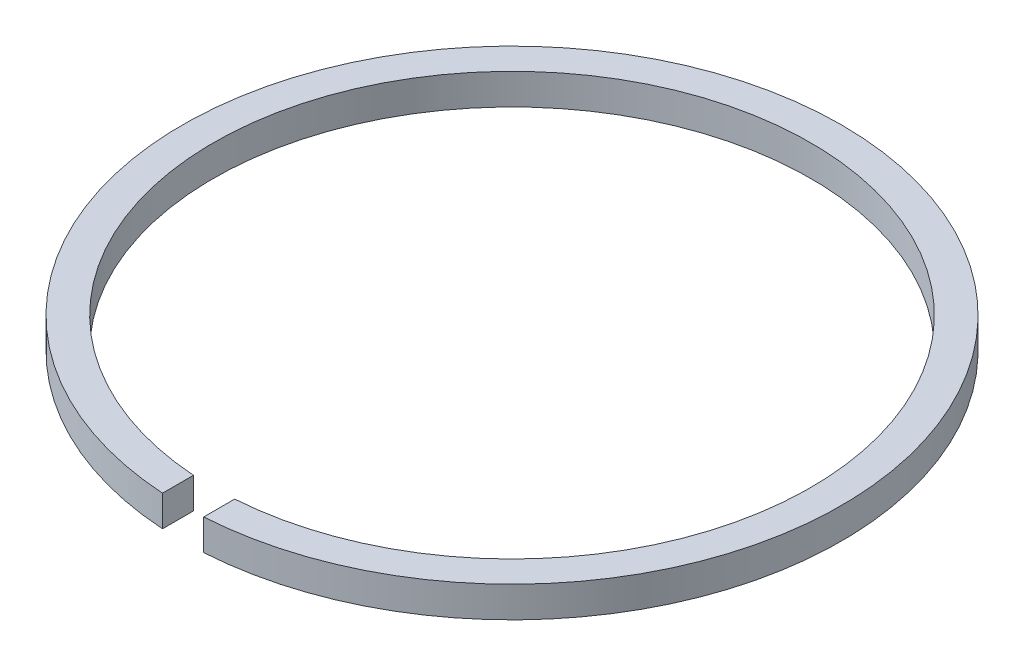
ISO-10303-21;
HEADER;
FILE_DESCRIPTION(('STEP AP214'),'2;1');
FILE_NAME('part.step','',(''),(''),'','','');
FILE_SCHEMA(('AUTOMOTIVE_DESIGN { 1 0 10303 214 1 1 1 1 }'));
ENDSEC;
DATA;
#1=APPLICATION_CONTEXT('core data for automotive mechanical design processes');
#2=APPLICATION_PROTOCOL_DEFINITION('international standard','automotive_design',2000,#1);
#3=PRODUCT_CONTEXT('',#1,'mechanical');
#4=PRODUCT('Part','Part','',(#3));
#5=PRODUCT_RELATED_PRODUCT_CATEGORY('part','',(#4));
#6=PRODUCT_DEFINITION_FORMATION('','',#4);
#7=PRODUCT_DEFINITION_CONTEXT('part definition',#1,'design');
#8=PRODUCT_DEFINITION('design','',#6,#7);
#9=PRODUCT_DEFINITION_SHAPE('','',#8);
#10=(LENGTH_UNIT() NAMED_UNIT(*) SI_UNIT(.MILLI.,.METRE.));
#11=(NAMED_UNIT(*) PLANE_ANGLE_UNIT() SI_UNIT($,.RADIAN.));
#12=(NAMED_UNIT(*) SI_UNIT($,.STERADIAN.) SOLID_ANGLE_UNIT());
#13=UNCERTAINTY_MEASURE_WITH_UNIT(LENGTH_MEASURE(1.E-05),#10,'distance_accuracy_value','');
#14=(GEOMETRIC_REPRESENTATION_CONTEXT(3) GLOBAL_UNCERTAINTY_ASSIGNED_CONTEXT((#13)) GLOBAL_UNIT_ASSIGNED_CONTEXT((#10,
#11,#12)) REPRESENTATION_CONTEXT('',''));
#15=CARTESIAN_POINT('',(0.,0.,0.));
#16=DIRECTION('',(0.,0.,1.));
#17=DIRECTION('',(1.,0.,0.));
#18=AXIS2_PLACEMENT_3D('',#15,#16,#17);
#19=CARTESIAN_POINT('',(0.,0.75,0.));
#20=DIRECTION('',(0.,-1.,0.));
#21=DIRECTION('',(0.,0.,-1.));
#22=AXIS2_PLACEMENT_3D('',#19,#20,#21);
#23=CYLINDRICAL_SURFACE('',#22,14.5);
#24=CARTESIAN_POINT('',(0.,-0.75,0.));
#25=DIRECTION('',(0.,-1.,0.));
#26=DIRECTION('',(0.,0.,1.));
#27=AXIS2_PLACEMENT_3D('',#24,#25,#26);
#28=CIRCLE('',#27,14.5);
#29=CARTESIAN_POINT('',(-0.999999999999998,-0.75,14.4654761414894));
#30=VERTEX_POINT('',#29);
#31=CARTESIAN_POINT('',(1.,-0.75,14.4654761414894));
#32=VERTEX_POINT('',#31);
#33=EDGE_CURVE('E106',#30,#32,#28,.T.);
#34=ORIENTED_EDGE('',*,*,#33,.T.);
#35=DIRECTION('',(0.,-1.,0.));
#36=VECTOR('',#35,1.);
#37=CARTESIAN_POINT('',(1.,0.75,14.4654761414894));
#38=LINE('',#37,#36);
#39=CARTESIAN_POINT('',(1.,0.75,14.4654761414894));
#40=VERTEX_POINT('',#39);
#41=EDGE_CURVE('E11',#40,#32,#38,.T.);
#42=ORIENTED_EDGE('',*,*,#41,.F.);
#43=CARTESIAN_POINT('',(0.,0.75,0.));
#44=DIRECTION('',(0.,-1.,0.));
#45=DIRECTION('',(0.,0.,1.));
#46=AXIS2_PLACEMENT_3D('',#43,#44,#45);
#47=CIRCLE('',#46,14.5);
#48=CARTESIAN_POINT('',(-0.999999999999998,0.75,14.4654761414894));
#49=VERTEX_POINT('',#48);
#50=EDGE_CURVE('E94',#49,#40,#47,.T.);
#51=ORIENTED_EDGE('',*,*,#50,.F.);
#52=DIRECTION('',(0.,-1.,0.));
#53=VECTOR('',#52,1.);
#54=CARTESIAN_POINT('',(-0.999999999999998,0.75,14.4654761414894));
#55=LINE('',#54,#53);
#56=EDGE_CURVE('E102',#49,#30,#55,.T.);
#57=ORIENTED_EDGE('',*,*,#56,.T.);
#58=EDGE_LOOP('',(#34,#42,#51,#57));
#59=FACE_BOUND('',#58,.T.);
#60=ADVANCED_FACE('F43',(#59),#23,.F.);
#61=CARTESIAN_POINT('',(1.,0.75,14.4654761414894));
#62=DIRECTION('',(1.,0.,0.));
#63=DIRECTION('',(0.,0.,-1.));
#64=AXIS2_PLACEMENT_3D('',#61,#62,#63);
#65=PLANE('',#64);
#66=DIRECTION('',(0.,0.,1.));
#67=VECTOR('',#66,1.);
#68=CARTESIAN_POINT('',(1.,-0.75,14.4654761414894));
#69=LINE('',#68,#67);
#70=CARTESIAN_POINT('',(1.,-0.75,15.9687194226713));
#71=VERTEX_POINT('',#70);
#72=EDGE_CURVE('E98',#32,#71,#69,.T.);
#73=ORIENTED_EDGE('',*,*,#72,.T.);
#74=DIRECTION('',(0.,-1.,0.));
#75=VECTOR('',#74,1.);
#76=CARTESIAN_POINT('',(1.,0.75,15.9687194226713));
#77=LINE('',#76,#75);
#78=CARTESIAN_POINT('',(1.,0.75,15.9687194226713));
#79=VERTEX_POINT('',#78);
#80=EDGE_CURVE('E51',#79,#71,#77,.T.);
#81=ORIENTED_EDGE('',*,*,#80,.F.);
#82=DIRECTION('',(0.,0.,1.));
#83=VECTOR('',#82,1.);
#84=CARTESIAN_POINT('',(1.,0.75,14.4654761414894));
#85=LINE('',#84,#83);
#86=EDGE_CURVE('E89',#40,#79,#85,.T.);
#87=ORIENTED_EDGE('',*,*,#86,.F.);
#88=ORIENTED_EDGE('',*,*,#41,.T.);
#89=EDGE_LOOP('',(#73,#81,#87,#88));
#90=FACE_BOUND('',#89,.T.);
#91=ADVANCED_FACE('F97',(#90),#65,.F.);
#92=CARTESIAN_POINT('',(0.,0.75,0.));
#93=DIRECTION('',(0.,-1.,0.));
#94=DIRECTION('',(0.,0.,-1.));
#95=AXIS2_PLACEMENT_3D('',#92,#93,#94);
#96=CYLINDRICAL_SURFACE('',#95,16.);
#97=CARTESIAN_POINT('',(0.,-0.75,0.));
#98=DIRECTION('',(0.,1.,0.));
#99=DIRECTION('',(0.,0.,1.));
#100=AXIS2_PLACEMENT_3D('',#97,#98,#99);
#101=CIRCLE('',#100,16.);
#102=CARTESIAN_POINT('',(-0.999999999999998,-0.75,15.9687194226713));
#103=VERTEX_POINT('',#102);
#104=EDGE_CURVE('E76',#71,#103,#101,.T.);
#105=ORIENTED_EDGE('',*,*,#104,.T.);
#106=DIRECTION('',(0.,-1.,0.));
#107=VECTOR('',#106,1.);
#108=CARTESIAN_POINT('',(-0.999999999999998,0.75,15.9687194226713));
#109=LINE('',#108,#107);
#110=CARTESIAN_POINT('',(-0.999999999999998,0.75,15.9687194226713));
#111=VERTEX_POINT('',#110);
#112=EDGE_CURVE('E99',#111,#103,#109,.T.);
#113=ORIENTED_EDGE('',*,*,#112,.F.);
#114=CARTESIAN_POINT('',(0.,0.75,0.));
#115=DIRECTION('',(0.,1.,0.));
#116=DIRECTION('',(0.,0.,1.));
#117=AXIS2_PLACEMENT_3D('',#114,#115,#116);
#118=CIRCLE('',#117,16.);
#119=EDGE_CURVE('E92',#79,#111,#118,.T.);
#120=ORIENTED_EDGE('',*,*,#119,.F.);
#121=ORIENTED_EDGE('',*,*,#80,.T.);
#122=EDGE_LOOP('',(#105,#113,#120,#121));
#123=FACE_BOUND('',#122,.T.);
#124=ADVANCED_FACE('F100',(#123),#96,.T.);
#125=CARTESIAN_POINT('',(-0.999999999999998,0.75,14.4654761414894));
#126=DIRECTION('',(-1.,0.,0.));
#127=DIRECTION('',(0.,0.,1.));
#128=AXIS2_PLACEMENT_3D('',#125,#126,#127);
#129=PLANE('',#128);
#130=DIRECTION('',(0.,0.,-1.));
#131=VECTOR('',#130,1.);
#132=CARTESIAN_POINT('',(-0.999999999999998,-0.75,14.4654761414894));
#133=LINE('',#132,#131);
#134=EDGE_CURVE('E82',#103,#30,#133,.T.);
#135=ORIENTED_EDGE('',*,*,#134,.T.);
#136=ORIENTED_EDGE('',*,*,#56,.F.);
#137=DIRECTION('',(0.,0.,-1.));
#138=VECTOR('',#137,1.);
#139=CARTESIAN_POINT('',(-0.999999999999998,0.75,14.4654761414894));
#140=LINE('',#139,#138);
#141=EDGE_CURVE('E59',#111,#49,#140,.T.);
#142=ORIENTED_EDGE('',*,*,#141,.F.);
#143=ORIENTED_EDGE('',*,*,#112,.T.);
#144=EDGE_LOOP('',(#135,#136,#142,#143));
#145=FACE_BOUND('',#144,.T.);
#146=ADVANCED_FACE('F113',(#145),#129,.F.);
#147=CARTESIAN_POINT('',(0.,0.75,0.));
#148=DIRECTION('',(0.,1.,0.));
#149=DIRECTION('',(0.,0.,1.));
#150=AXIS2_PLACEMENT_3D('',#147,#148,#149);
#151=PLANE('',#150);
#152=ORIENTED_EDGE('',*,*,#50,.T.);
#153=ORIENTED_EDGE('',*,*,#86,.T.);
#154=ORIENTED_EDGE('',*,*,#119,.T.);
#155=ORIENTED_EDGE('',*,*,#141,.T.);
#156=EDGE_LOOP('',(#152,#153,#154,#155));
#157=FACE_BOUND('',#156,.T.);
#158=ADVANCED_FACE('F90',(#157),#151,.T.);
#159=CARTESIAN_POINT('',(0.,-0.75,0.));
#160=DIRECTION('',(0.,1.,0.));
#161=DIRECTION('',(0.,0.,1.));
#162=AXIS2_PLACEMENT_3D('',#159,#160,#161);
#163=PLANE('',#162);
#164=ORIENTED_EDGE('',*,*,#33,.F.);
#165=ORIENTED_EDGE('',*,*,#134,.F.);
#166=ORIENTED_EDGE('',*,*,#104,.F.);
#167=ORIENTED_EDGE('',*,*,#72,.F.);
#168=EDGE_LOOP('',(#164,#165,#166,#167));
#169=FACE_BOUND('',#168,.T.);
#170=ADVANCED_FACE('F116',(#169),#163,.F.);
#171=CLOSED_SHELL('',(#60,#91,#124,#146,#158,#170));
#172=MANIFOLD_SOLID_BREP('B2',#171);
#173=ADVANCED_BREP_SHAPE_REPRESENTATION('',(#18,#172),#14);
#174=SHAPE_DEFINITION_REPRESENTATION(#9,#173);
ENDSEC;
END-ISO-10303-21;
